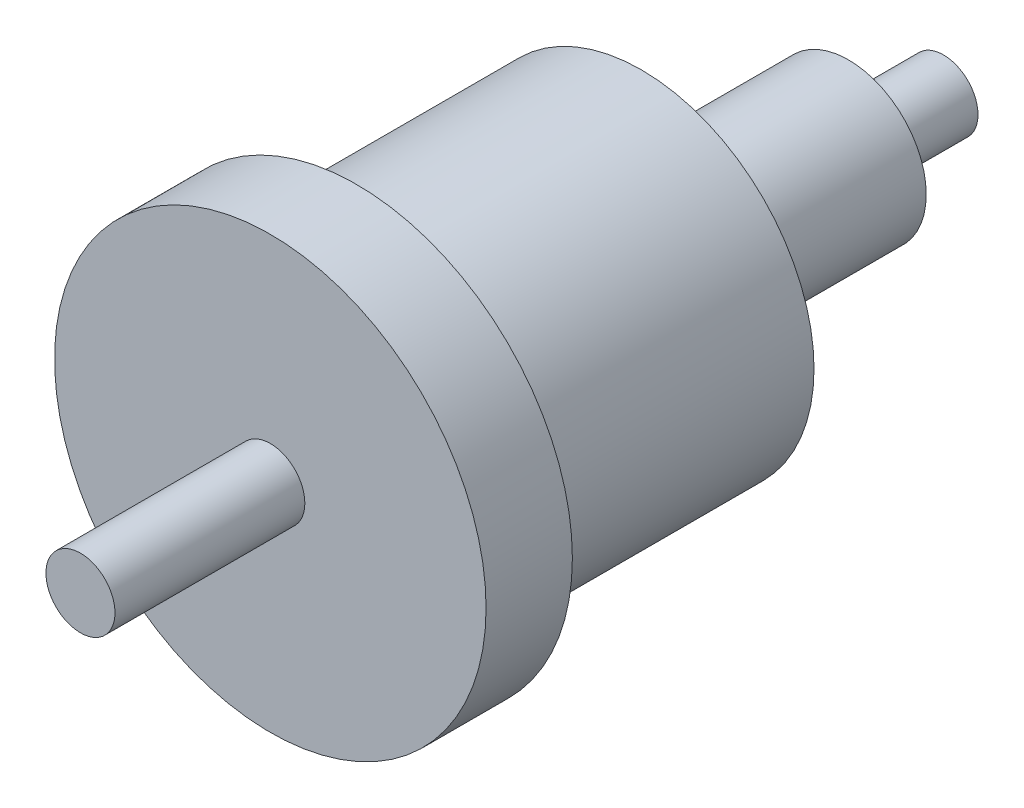
ISO-10303-21;
HEADER;
FILE_DESCRIPTION(('STEP AP214'),'2;1');
FILE_NAME('part.step','',(''),(''),'','','');
FILE_SCHEMA(('AUTOMOTIVE_DESIGN { 1 0 10303 214 1 1 1 1 }'));
ENDSEC;
DATA;
#1=APPLICATION_CONTEXT('core data for automotive mechanical design processes');
#2=APPLICATION_PROTOCOL_DEFINITION('international standard','automotive_design',2000,#1);
#3=PRODUCT_CONTEXT('',#1,'mechanical');
#4=PRODUCT('Part','Part','',(#3));
#5=PRODUCT_RELATED_PRODUCT_CATEGORY('part','',(#4));
#6=PRODUCT_DEFINITION_FORMATION('','',#4);
#7=PRODUCT_DEFINITION_CONTEXT('part definition',#1,'design');
#8=PRODUCT_DEFINITION('design','',#6,#7);
#9=PRODUCT_DEFINITION_SHAPE('','',#8);
#10=(LENGTH_UNIT() NAMED_UNIT(*) SI_UNIT(.MILLI.,.METRE.));
#11=(NAMED_UNIT(*) PLANE_ANGLE_UNIT() SI_UNIT($,.RADIAN.));
#12=(NAMED_UNIT(*) SI_UNIT($,.STERADIAN.) SOLID_ANGLE_UNIT());
#13=UNCERTAINTY_MEASURE_WITH_UNIT(LENGTH_MEASURE(1.E-05),#10,'distance_accuracy_value','');
#14=(GEOMETRIC_REPRESENTATION_CONTEXT(3) GLOBAL_UNCERTAINTY_ASSIGNED_CONTEXT((#13)) GLOBAL_UNIT_ASSIGNED_CONTEXT((#10,
#11,#12)) REPRESENTATION_CONTEXT('',''));
#15=CARTESIAN_POINT('',(0.,0.,0.));
#16=DIRECTION('',(0.,0.,1.));
#17=DIRECTION('',(1.,0.,0.));
#18=AXIS2_PLACEMENT_3D('',#15,#16,#17);
#19=CARTESIAN_POINT('',(0.,0.,1.1));
#20=DIRECTION('',(0.,0.,-1.));
#21=DIRECTION('',(-1.,0.,0.));
#22=AXIS2_PLACEMENT_3D('',#19,#20,#21);
#23=CYLINDRICAL_SURFACE('',#22,0.4);
#24=CARTESIAN_POINT('',(0.,0.,1.1));
#25=DIRECTION('',(0.,0.,1.));
#26=DIRECTION('',(1.,0.,0.));
#27=AXIS2_PLACEMENT_3D('',#24,#25,#26);
#28=CIRCLE('',#27,0.4);
#29=CARTESIAN_POINT('',(0.4,0.,1.1));
#30=VERTEX_POINT('',#29);
#31=EDGE_CURVE('E38',#30,#30,#28,.T.);
#32=ORIENTED_EDGE('',*,*,#31,.F.);
#33=EDGE_LOOP('',(#32));
#34=FACE_BOUND('',#33,.T.);
#35=CARTESIAN_POINT('',(0.,0.,0.));
#36=DIRECTION('',(0.,0.,1.));
#37=DIRECTION('',(1.,0.,0.));
#38=AXIS2_PLACEMENT_3D('',#35,#36,#37);
#39=CIRCLE('',#38,0.4);
#40=CARTESIAN_POINT('',(0.4,0.,0.));
#41=VERTEX_POINT('',#40);
#42=EDGE_CURVE('E34',#41,#41,#39,.T.);
#43=ORIENTED_EDGE('',*,*,#42,.T.);
#44=EDGE_LOOP('',(#43));
#45=FACE_BOUND('',#44,.T.);
#46=ADVANCED_FACE('F31',(#34,#45),#23,.T.);
#47=CARTESIAN_POINT('',(0.,0.,0.));
#48=DIRECTION('',(0.,0.,1.));
#49=DIRECTION('',(1.,0.,0.));
#50=AXIS2_PLACEMENT_3D('',#47,#48,#49);
#51=PLANE('',#50);
#52=ORIENTED_EDGE('',*,*,#42,.F.);
#53=EDGE_LOOP('',(#52));
#54=FACE_BOUND('',#53,.T.);
#55=ADVANCED_FACE('F79',(#54),#51,.F.);
#56=CARTESIAN_POINT('',(0.,0.,3.5));
#57=DIRECTION('',(0.,0.,-1.));
#58=DIRECTION('',(-1.,0.,0.));
#59=AXIS2_PLACEMENT_3D('',#56,#57,#58);
#60=CYLINDRICAL_SURFACE('',#59,0.9);
#61=CARTESIAN_POINT('',(0.,0.,3.5));
#62=DIRECTION('',(0.,0.,1.));
#63=DIRECTION('',(1.,0.,0.));
#64=AXIS2_PLACEMENT_3D('',#61,#62,#63);
#65=CIRCLE('',#64,0.9);
#66=CARTESIAN_POINT('',(0.9,0.,3.5));
#67=VERTEX_POINT('',#66);
#68=EDGE_CURVE('E59',#67,#67,#65,.T.);
#69=ORIENTED_EDGE('',*,*,#68,.F.);
#70=EDGE_LOOP('',(#69));
#71=FACE_BOUND('',#70,.T.);
#72=CARTESIAN_POINT('',(0.,0.,1.1));
#73=DIRECTION('',(0.,0.,1.));
#74=DIRECTION('',(1.,0.,0.));
#75=AXIS2_PLACEMENT_3D('',#72,#73,#74);
#76=CIRCLE('',#75,0.9);
#77=CARTESIAN_POINT('',(0.9,0.,1.1));
#78=VERTEX_POINT('',#77);
#79=EDGE_CURVE('E56',#78,#78,#76,.T.);
#80=ORIENTED_EDGE('',*,*,#79,.T.);
#81=EDGE_LOOP('',(#80));
#82=FACE_BOUND('',#81,.T.);
#83=ADVANCED_FACE('F65',(#71,#82),#60,.T.);
#84=CARTESIAN_POINT('',(0.,0.,1.1));
#85=DIRECTION('',(0.,0.,1.));
#86=DIRECTION('',(1.,0.,0.));
#87=AXIS2_PLACEMENT_3D('',#84,#85,#86);
#88=PLANE('',#87);
#89=ORIENTED_EDGE('',*,*,#31,.T.);
#90=EDGE_LOOP('',(#89));
#91=FACE_BOUND('',#90,.T.);
#92=ORIENTED_EDGE('',*,*,#79,.F.);
#93=EDGE_LOOP('',(#92));
#94=FACE_BOUND('',#93,.T.);
#95=ADVANCED_FACE('F67',(#91,#94),#88,.F.);
#96=CARTESIAN_POINT('',(0.,0.,6.8));
#97=DIRECTION('',(0.,0.,-1.));
#98=DIRECTION('',(-1.,0.,0.));
#99=AXIS2_PLACEMENT_3D('',#96,#97,#98);
#100=CYLINDRICAL_SURFACE('',#99,2.);
#101=CARTESIAN_POINT('',(0.,0.,6.8));
#102=DIRECTION('',(0.,0.,1.));
#103=DIRECTION('',(1.,0.,0.));
#104=AXIS2_PLACEMENT_3D('',#101,#102,#103);
#105=CIRCLE('',#104,2.);
#106=CARTESIAN_POINT('',(2.,0.,6.8));
#107=VERTEX_POINT('',#106);
#108=EDGE_CURVE('E53',#107,#107,#105,.T.);
#109=ORIENTED_EDGE('',*,*,#108,.F.);
#110=EDGE_LOOP('',(#109));
#111=FACE_BOUND('',#110,.T.);
#112=CARTESIAN_POINT('',(0.,0.,3.5));
#113=DIRECTION('',(0.,0.,1.));
#114=DIRECTION('',(1.,0.,0.));
#115=AXIS2_PLACEMENT_3D('',#112,#113,#114);
#116=CIRCLE('',#115,2.);
#117=CARTESIAN_POINT('',(2.,0.,3.5));
#118=VERTEX_POINT('',#117);
#119=EDGE_CURVE('E49',#118,#118,#116,.T.);
#120=ORIENTED_EDGE('',*,*,#119,.T.);
#121=EDGE_LOOP('',(#120));
#122=FACE_BOUND('',#121,.T.);
#123=ADVANCED_FACE('F69',(#111,#122),#100,.T.);
#124=CARTESIAN_POINT('',(0.,0.,3.5));
#125=DIRECTION('',(0.,0.,1.));
#126=DIRECTION('',(1.,0.,0.));
#127=AXIS2_PLACEMENT_3D('',#124,#125,#126);
#128=PLANE('',#127);
#129=ORIENTED_EDGE('',*,*,#68,.T.);
#130=EDGE_LOOP('',(#129));
#131=FACE_BOUND('',#130,.T.);
#132=ORIENTED_EDGE('',*,*,#119,.F.);
#133=EDGE_LOOP('',(#132));
#134=FACE_BOUND('',#133,.T.);
#135=ADVANCED_FACE('F76',(#131,#134),#128,.F.);
#136=CARTESIAN_POINT('',(0.,0.,7.8));
#137=DIRECTION('',(0.,0.,-1.));
#138=DIRECTION('',(-1.,0.,0.));
#139=AXIS2_PLACEMENT_3D('',#136,#137,#138);
#140=CYLINDRICAL_SURFACE('',#139,2.5);
#141=CARTESIAN_POINT('',(0.,0.,7.8));
#142=DIRECTION('',(0.,0.,1.));
#143=DIRECTION('',(1.,0.,0.));
#144=AXIS2_PLACEMENT_3D('',#141,#142,#143);
#145=CIRCLE('',#144,2.5);
#146=CARTESIAN_POINT('',(2.5,0.,7.8));
#147=VERTEX_POINT('',#146);
#148=EDGE_CURVE('E46',#147,#147,#145,.T.);
#149=ORIENTED_EDGE('',*,*,#148,.F.);
#150=EDGE_LOOP('',(#149));
#151=FACE_BOUND('',#150,.T.);
#152=CARTESIAN_POINT('',(0.,0.,6.8));
#153=DIRECTION('',(0.,0.,1.));
#154=DIRECTION('',(1.,0.,0.));
#155=AXIS2_PLACEMENT_3D('',#152,#153,#154);
#156=CIRCLE('',#155,2.5);
#157=CARTESIAN_POINT('',(2.5,0.,6.8));
#158=VERTEX_POINT('',#157);
#159=EDGE_CURVE('E50',#158,#158,#156,.T.);
#160=ORIENTED_EDGE('',*,*,#159,.T.);
#161=EDGE_LOOP('',(#160));
#162=FACE_BOUND('',#161,.T.);
#163=ADVANCED_FACE('F117',(#151,#162),#140,.T.);
#164=CARTESIAN_POINT('',(0.,0.,7.8));
#165=DIRECTION('',(0.,0.,1.));
#166=DIRECTION('',(1.,0.,0.));
#167=AXIS2_PLACEMENT_3D('',#164,#165,#166);
#168=PLANE('',#167);
#169=CARTESIAN_POINT('',(0.,0.,7.8));
#170=DIRECTION('',(0.,0.,1.));
#171=DIRECTION('',(1.,0.,0.));
#172=AXIS2_PLACEMENT_3D('',#169,#170,#171);
#173=CIRCLE('',#172,0.4);
#174=CARTESIAN_POINT('',(0.4,0.,7.8));
#175=VERTEX_POINT('',#174);
#176=EDGE_CURVE('E10',#175,#175,#173,.T.);
#177=ORIENTED_EDGE('',*,*,#176,.F.);
#178=EDGE_LOOP('',(#177));
#179=FACE_BOUND('',#178,.T.);
#180=ORIENTED_EDGE('',*,*,#148,.T.);
#181=EDGE_LOOP('',(#180));
#182=FACE_BOUND('',#181,.T.);
#183=ADVANCED_FACE('F127',(#179,#182),#168,.T.);
#184=CARTESIAN_POINT('',(0.,0.,6.8));
#185=DIRECTION('',(0.,0.,1.));
#186=DIRECTION('',(1.,0.,0.));
#187=AXIS2_PLACEMENT_3D('',#184,#185,#186);
#188=PLANE('',#187);
#189=ORIENTED_EDGE('',*,*,#108,.T.);
#190=EDGE_LOOP('',(#189));
#191=FACE_BOUND('',#190,.T.);
#192=ORIENTED_EDGE('',*,*,#159,.F.);
#193=EDGE_LOOP('',(#192));
#194=FACE_BOUND('',#193,.T.);
#195=ADVANCED_FACE('F135',(#191,#194),#188,.F.);
#196=CARTESIAN_POINT('',(0.,0.,10.));
#197=DIRECTION('',(0.,0.,-1.));
#198=DIRECTION('',(-1.,0.,0.));
#199=AXIS2_PLACEMENT_3D('',#196,#197,#198);
#200=CYLINDRICAL_SURFACE('',#199,0.4);
#201=CARTESIAN_POINT('',(0.,0.,10.));
#202=DIRECTION('',(0.,0.,1.));
#203=DIRECTION('',(1.,0.,0.));
#204=AXIS2_PLACEMENT_3D('',#201,#202,#203);
#205=CIRCLE('',#204,0.4);
#206=CARTESIAN_POINT('',(0.4,0.,10.));
#207=VERTEX_POINT('',#206);
#208=EDGE_CURVE('E45',#207,#207,#205,.T.);
#209=ORIENTED_EDGE('',*,*,#208,.F.);
#210=EDGE_LOOP('',(#209));
#211=FACE_BOUND('',#210,.T.);
#212=ORIENTED_EDGE('',*,*,#176,.T.);
#213=EDGE_LOOP('',(#212));
#214=FACE_BOUND('',#213,.T.);
#215=ADVANCED_FACE('F140',(#211,#214),#200,.T.);
#216=CARTESIAN_POINT('',(0.,0.,10.));
#217=DIRECTION('',(0.,0.,1.));
#218=DIRECTION('',(1.,0.,0.));
#219=AXIS2_PLACEMENT_3D('',#216,#217,#218);
#220=PLANE('',#219);
#221=ORIENTED_EDGE('',*,*,#208,.T.);
#222=EDGE_LOOP('',(#221));
#223=FACE_BOUND('',#222,.T.);
#224=ADVANCED_FACE('F157',(#223),#220,.T.);
#225=CLOSED_SHELL('',(#46,#55,#83,#95,#123,#135,#163,#183,#195,#215,#224));
#226=MANIFOLD_SOLID_BREP('B2',#225);
#227=ADVANCED_BREP_SHAPE_REPRESENTATION('',(#18,#226),#14);
#228=SHAPE_DEFINITION_REPRESENTATION(#9,#227);
ENDSEC;
END-ISO-10303-21;
